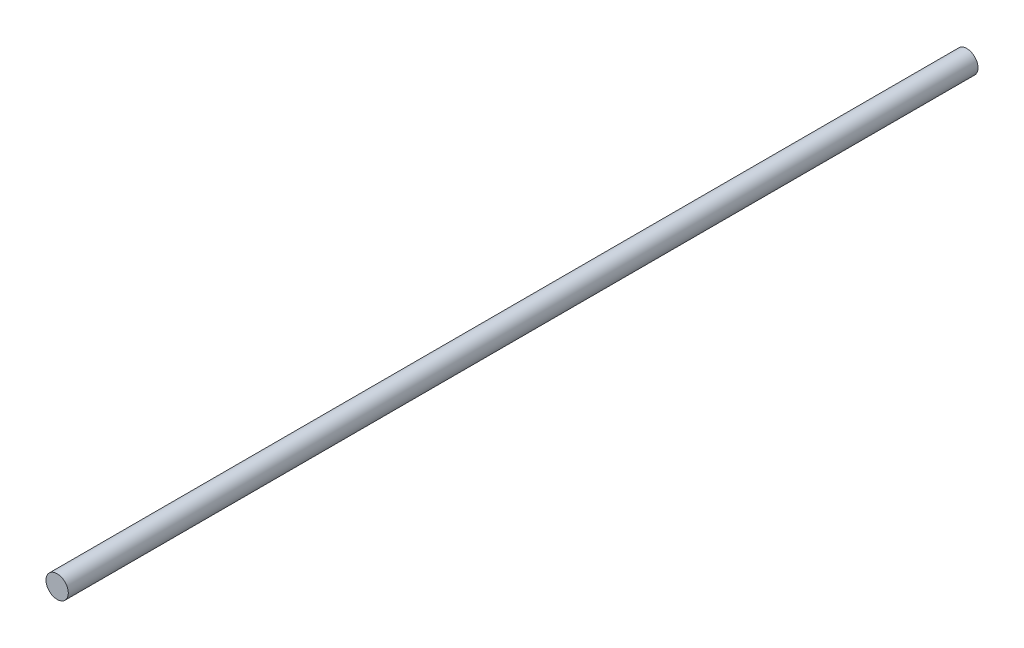
ISO-10303-21;
HEADER;
FILE_DESCRIPTION(('STEP AP214'),'2;1');
FILE_NAME('part.step','',(''),(''),'','','');
FILE_SCHEMA(('AUTOMOTIVE_DESIGN { 1 0 10303 214 1 1 1 1 }'));
ENDSEC;
DATA;
#1=APPLICATION_CONTEXT('core data for automotive mechanical design processes');
#2=APPLICATION_PROTOCOL_DEFINITION('international standard','automotive_design',2000,#1);
#3=PRODUCT_CONTEXT('',#1,'mechanical');
#4=PRODUCT('Part','Part','',(#3));
#5=PRODUCT_RELATED_PRODUCT_CATEGORY('part','',(#4));
#6=PRODUCT_DEFINITION_FORMATION('','',#4);
#7=PRODUCT_DEFINITION_CONTEXT('part definition',#1,'design');
#8=PRODUCT_DEFINITION('design','',#6,#7);
#9=PRODUCT_DEFINITION_SHAPE('','',#8);
#10=(LENGTH_UNIT() NAMED_UNIT(*) SI_UNIT(.MILLI.,.METRE.));
#11=(NAMED_UNIT(*) PLANE_ANGLE_UNIT() SI_UNIT($,.RADIAN.));
#12=(NAMED_UNIT(*) SI_UNIT($,.STERADIAN.) SOLID_ANGLE_UNIT());
#13=UNCERTAINTY_MEASURE_WITH_UNIT(LENGTH_MEASURE(1.E-05),#10,'distance_accuracy_value','');
#14=(GEOMETRIC_REPRESENTATION_CONTEXT(3) GLOBAL_UNCERTAINTY_ASSIGNED_CONTEXT((#13)) GLOBAL_UNIT_ASSIGNED_CONTEXT((#10,
#11,#12)) REPRESENTATION_CONTEXT('',''));
#15=CARTESIAN_POINT('',(0.,0.,0.));
#16=DIRECTION('',(0.,0.,1.));
#17=DIRECTION('',(1.,0.,0.));
#18=AXIS2_PLACEMENT_3D('',#15,#16,#17);
#19=CARTESIAN_POINT('',(0.,0.,326.));
#20=DIRECTION('',(0.,0.,-1.));
#21=DIRECTION('',(-1.,0.,0.));
#22=AXIS2_PLACEMENT_3D('',#19,#20,#21);
#23=CYLINDRICAL_SURFACE('',#22,4.);
#24=CARTESIAN_POINT('',(0.,0.,326.));
#25=DIRECTION('',(0.,0.,1.));
#26=DIRECTION('',(1.,0.,0.));
#27=AXIS2_PLACEMENT_3D('',#24,#25,#26);
#28=CIRCLE('',#27,4.);
#29=CARTESIAN_POINT('',(4.,0.,326.));
#30=VERTEX_POINT('',#29);
#31=EDGE_CURVE('E10',#30,#30,#28,.T.);
#32=ORIENTED_EDGE('',*,*,#31,.F.);
#33=EDGE_LOOP('',(#32));
#34=FACE_BOUND('',#33,.T.);
#35=CARTESIAN_POINT('',(0.,0.,0.));
#36=DIRECTION('',(0.,0.,1.));
#37=DIRECTION('',(1.,0.,0.));
#38=AXIS2_PLACEMENT_3D('',#35,#36,#37);
#39=CIRCLE('',#38,4.);
#40=CARTESIAN_POINT('',(4.,0.,0.));
#41=VERTEX_POINT('',#40);
#42=EDGE_CURVE('E34',#41,#41,#39,.T.);
#43=ORIENTED_EDGE('',*,*,#42,.T.);
#44=EDGE_LOOP('',(#43));
#45=FACE_BOUND('',#44,.T.);
#46=ADVANCED_FACE('F31',(#34,#45),#23,.T.);
#47=CARTESIAN_POINT('',(0.,0.,326.));
#48=DIRECTION('',(0.,0.,1.));
#49=DIRECTION('',(1.,0.,0.));
#50=AXIS2_PLACEMENT_3D('',#47,#48,#49);
#51=PLANE('',#50);
#52=ORIENTED_EDGE('',*,*,#31,.T.);
#53=EDGE_LOOP('',(#52));
#54=FACE_BOUND('',#53,.T.);
#55=ADVANCED_FACE('F46',(#54),#51,.T.);
#56=CARTESIAN_POINT('',(0.,0.,0.));
#57=DIRECTION('',(0.,0.,1.));
#58=DIRECTION('',(1.,0.,0.));
#59=AXIS2_PLACEMENT_3D('',#56,#57,#58);
#60=PLANE('',#59);
#61=ORIENTED_EDGE('',*,*,#42,.F.);
#62=EDGE_LOOP('',(#61));
#63=FACE_BOUND('',#62,.T.);
#64=ADVANCED_FACE('F44',(#63),#60,.F.);
#65=CLOSED_SHELL('',(#46,#55,#64));
#66=MANIFOLD_SOLID_BREP('B2',#65);
#67=ADVANCED_BREP_SHAPE_REPRESENTATION('',(#18,#66),#14);
#68=SHAPE_DEFINITION_REPRESENTATION(#9,#67);
ENDSEC;
END-ISO-10303-21;
